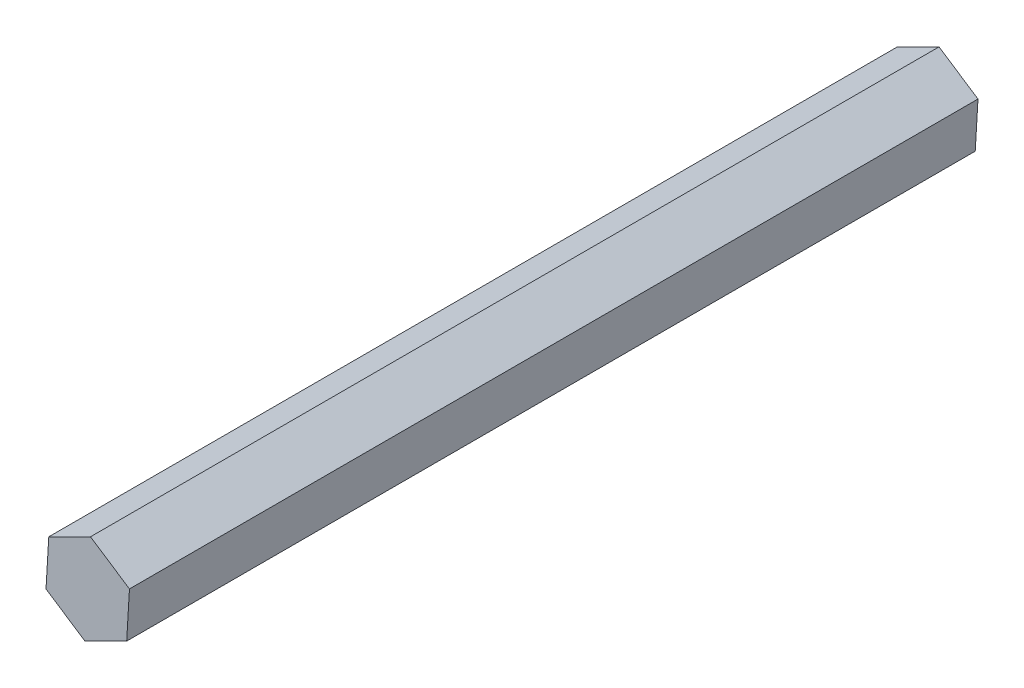
ISO-10303-21;
HEADER;
FILE_DESCRIPTION(('STEP AP214'),'2;1');
FILE_NAME('part.step','',(''),(''),'','','');
FILE_SCHEMA(('AUTOMOTIVE_DESIGN { 1 0 10303 214 1 1 1 1 }'));
ENDSEC;
DATA;
#1=APPLICATION_CONTEXT('core data for automotive mechanical design processes');
#2=APPLICATION_PROTOCOL_DEFINITION('international standard','automotive_design',2000,#1);
#3=PRODUCT_CONTEXT('',#1,'mechanical');
#4=PRODUCT('Part','Part','',(#3));
#5=PRODUCT_RELATED_PRODUCT_CATEGORY('part','',(#4));
#6=PRODUCT_DEFINITION_FORMATION('','',#4);
#7=PRODUCT_DEFINITION_CONTEXT('part definition',#1,'design');
#8=PRODUCT_DEFINITION('design','',#6,#7);
#9=PRODUCT_DEFINITION_SHAPE('','',#8);
#10=(LENGTH_UNIT() NAMED_UNIT(*) SI_UNIT(.MILLI.,.METRE.));
#11=(NAMED_UNIT(*) PLANE_ANGLE_UNIT() SI_UNIT($,.RADIAN.));
#12=(NAMED_UNIT(*) SI_UNIT($,.STERADIAN.) SOLID_ANGLE_UNIT());
#13=UNCERTAINTY_MEASURE_WITH_UNIT(LENGTH_MEASURE(1.E-05),#10,'distance_accuracy_value','');
#14=(GEOMETRIC_REPRESENTATION_CONTEXT(3) GLOBAL_UNCERTAINTY_ASSIGNED_CONTEXT((#13)) GLOBAL_UNIT_ASSIGNED_CONTEXT((#10,
#11,#12)) REPRESENTATION_CONTEXT('',''));
#15=CARTESIAN_POINT('',(0.,0.,0.));
#16=DIRECTION('',(0.,0.,1.));
#17=DIRECTION('',(1.,0.,0.));
#18=AXIS2_PLACEMENT_3D('',#15,#16,#17);
#19=CARTESIAN_POINT('',(4.59046471627994,-3.02811966219777,100.));
#20=DIRECTION('',(-0.998228412344605,0.059498208275286,0.));
#21=DIRECTION('',(-0.059498208275286,-0.998228412344605,0.));
#22=AXIS2_PLACEMENT_3D('',#19,#20,#21);
#23=PLANE('',#22);
#24=DIRECTION('',(0.059498208275286,0.998228412344605,0.));
#25=VECTOR('',#24,1.);
#26=CARTESIAN_POINT('',(4.59046471627994,-3.02811966219777,0.));
#27=LINE('',#26,#25);
#28=CARTESIAN_POINT('',(4.59046471627994,-3.02811966219777,0.));
#29=VERTEX_POINT('',#28);
#30=CARTESIAN_POINT('',(4.91766091130239,2.46139922837567,0.));
#31=VERTEX_POINT('',#30);
#32=EDGE_CURVE('E118',#29,#31,#27,.T.);
#33=ORIENTED_EDGE('',*,*,#32,.T.);
#34=DIRECTION('',(0.,0.,-1.));
#35=VECTOR('',#34,1.);
#36=CARTESIAN_POINT('',(4.91766091130239,2.46139922837567,100.));
#37=LINE('',#36,#35);
#38=CARTESIAN_POINT('',(4.91766091130239,2.46139922837567,100.));
#39=VERTEX_POINT('',#38);
#40=EDGE_CURVE('E11',#39,#31,#37,.T.);
#41=ORIENTED_EDGE('',*,*,#40,.F.);
#42=DIRECTION('',(0.059498208275286,0.998228412344605,0.));
#43=VECTOR('',#42,1.);
#44=CARTESIAN_POINT('',(4.59046471627994,-3.02811966219777,100.));
#45=LINE('',#44,#43);
#46=CARTESIAN_POINT('',(4.59046471627994,-3.02811966219777,100.));
#47=VERTEX_POINT('',#46);
#48=EDGE_CURVE('E128',#47,#39,#45,.T.);
#49=ORIENTED_EDGE('',*,*,#48,.F.);
#50=DIRECTION('',(0.,0.,-1.));
#51=VECTOR('',#50,1.);
#52=CARTESIAN_POINT('',(4.59046471627994,-3.02811966219777,100.));
#53=LINE('',#52,#51);
#54=EDGE_CURVE('E114',#47,#29,#53,.T.);
#55=ORIENTED_EDGE('',*,*,#54,.T.);
#56=EDGE_LOOP('',(#33,#41,#49,#55));
#57=FACE_BOUND('',#56,.T.);
#58=ADVANCED_FACE('F34',(#57),#23,.F.);
#59=CARTESIAN_POINT('',(4.91766091130239,2.46139922837567,100.));
#60=DIRECTION('',(-0.550641166018358,-0.834742059732193,0.));
#61=DIRECTION('',(0.834742059732193,-0.550641166018358,0.));
#62=AXIS2_PLACEMENT_3D('',#59,#60,#61);
#63=PLANE('',#62);
#64=DIRECTION('',(-0.834742059732193,0.550641166018358,0.));
#65=VECTOR('',#64,1.);
#66=CARTESIAN_POINT('',(4.91766091130239,2.46139922837567,0.));
#67=LINE('',#66,#65);
#68=CARTESIAN_POINT('',(0.32719619502245,5.48951889057344,0.));
#69=VERTEX_POINT('',#68);
#70=EDGE_CURVE('E121',#31,#69,#67,.T.);
#71=ORIENTED_EDGE('',*,*,#70,.T.);
#72=DIRECTION('',(0.,0.,-1.));
#73=VECTOR('',#72,1.);
#74=CARTESIAN_POINT('',(0.32719619502245,5.48951889057344,100.));
#75=LINE('',#74,#73);
#76=CARTESIAN_POINT('',(0.32719619502245,5.48951889057344,100.));
#77=VERTEX_POINT('',#76);
#78=EDGE_CURVE('E42',#77,#69,#75,.T.);
#79=ORIENTED_EDGE('',*,*,#78,.F.);
#80=DIRECTION('',(-0.834742059732193,0.550641166018358,0.));
#81=VECTOR('',#80,1.);
#82=CARTESIAN_POINT('',(4.91766091130239,2.46139922837567,100.));
#83=LINE('',#82,#81);
#84=EDGE_CURVE('E87',#39,#77,#83,.T.);
#85=ORIENTED_EDGE('',*,*,#84,.F.);
#86=ORIENTED_EDGE('',*,*,#40,.T.);
#87=EDGE_LOOP('',(#71,#79,#85,#86));
#88=FACE_BOUND('',#87,.T.);
#89=ADVANCED_FACE('F152',(#88),#63,.F.);
#90=CARTESIAN_POINT('',(0.32719619502245,5.48951889057344,100.));
#91=DIRECTION('',(0.447587246326247,-0.894240268007479,0.));
#92=DIRECTION('',(0.894240268007479,0.447587246326247,0.));
#93=AXIS2_PLACEMENT_3D('',#90,#91,#92);
#94=PLANE('',#93);
#95=DIRECTION('',(-0.894240268007479,-0.447587246326247,0.));
#96=VECTOR('',#95,1.);
#97=CARTESIAN_POINT('',(0.32719619502245,5.48951889057344,0.));
#98=LINE('',#97,#96);
#99=CARTESIAN_POINT('',(-4.59046471627994,3.02811966219777,0.));
#100=VERTEX_POINT('',#99);
#101=EDGE_CURVE('E123',#69,#100,#98,.T.);
#102=ORIENTED_EDGE('',*,*,#101,.T.);
#103=DIRECTION('',(0.,0.,-1.));
#104=VECTOR('',#103,1.);
#105=CARTESIAN_POINT('',(-4.59046471627994,3.02811966219777,100.));
#106=LINE('',#105,#104);
#107=CARTESIAN_POINT('',(-4.59046471627994,3.02811966219777,100.));
#108=VERTEX_POINT('',#107);
#109=EDGE_CURVE('E109',#108,#100,#106,.T.);
#110=ORIENTED_EDGE('',*,*,#109,.F.);
#111=DIRECTION('',(-0.894240268007479,-0.447587246326247,0.));
#112=VECTOR('',#111,1.);
#113=CARTESIAN_POINT('',(0.32719619502245,5.48951889057344,100.));
#114=LINE('',#113,#112);
#115=EDGE_CURVE('E100',#77,#108,#114,.T.);
#116=ORIENTED_EDGE('',*,*,#115,.F.);
#117=ORIENTED_EDGE('',*,*,#78,.T.);
#118=EDGE_LOOP('',(#102,#110,#116,#117));
#119=FACE_BOUND('',#118,.T.);
#120=ADVANCED_FACE('F134',(#119),#94,.F.);
#121=CARTESIAN_POINT('',(-4.59046471627994,3.02811966219777,100.));
#122=DIRECTION('',(0.998228412344605,-0.059498208275286,0.));
#123=DIRECTION('',(0.059498208275286,0.998228412344605,0.));
#124=AXIS2_PLACEMENT_3D('',#121,#122,#123);
#125=PLANE('',#124);
#126=DIRECTION('',(-0.059498208275286,-0.998228412344605,0.));
#127=VECTOR('',#126,1.);
#128=CARTESIAN_POINT('',(-4.59046471627994,3.02811966219777,0.));
#129=LINE('',#128,#127);
#130=CARTESIAN_POINT('',(-4.91766091130239,-2.46139922837567,0.));
#131=VERTEX_POINT('',#130);
#132=EDGE_CURVE('E108',#100,#131,#129,.T.);
#133=ORIENTED_EDGE('',*,*,#132,.T.);
#134=DIRECTION('',(0.,0.,-1.));
#135=VECTOR('',#134,1.);
#136=CARTESIAN_POINT('',(-4.91766091130239,-2.46139922837567,100.));
#137=LINE('',#136,#135);
#138=CARTESIAN_POINT('',(-4.91766091130239,-2.46139922837567,100.));
#139=VERTEX_POINT('',#138);
#140=EDGE_CURVE('E105',#139,#131,#137,.T.);
#141=ORIENTED_EDGE('',*,*,#140,.F.);
#142=DIRECTION('',(-0.059498208275286,-0.998228412344605,0.));
#143=VECTOR('',#142,1.);
#144=CARTESIAN_POINT('',(-4.59046471627994,3.02811966219777,100.));
#145=LINE('',#144,#143);
#146=EDGE_CURVE('E94',#108,#139,#145,.T.);
#147=ORIENTED_EDGE('',*,*,#146,.F.);
#148=ORIENTED_EDGE('',*,*,#109,.T.);
#149=EDGE_LOOP('',(#133,#141,#147,#148));
#150=FACE_BOUND('',#149,.T.);
#151=ADVANCED_FACE('F106',(#150),#125,.F.);
#152=CARTESIAN_POINT('',(-4.91766091130239,-2.46139922837567,100.));
#153=DIRECTION('',(0.550641166018358,0.834742059732193,0.));
#154=DIRECTION('',(-0.834742059732193,0.550641166018358,0.));
#155=AXIS2_PLACEMENT_3D('',#152,#153,#154);
#156=PLANE('',#155);
#157=DIRECTION('',(0.834742059732192,-0.550641166018358,0.));
#158=VECTOR('',#157,1.);
#159=CARTESIAN_POINT('',(-4.91766091130239,-2.46139922837567,0.));
#160=LINE('',#159,#158);
#161=CARTESIAN_POINT('',(-0.327196195022453,-5.48951889057344,0.));
#162=VERTEX_POINT('',#161);
#163=EDGE_CURVE('E73',#131,#162,#160,.T.);
#164=ORIENTED_EDGE('',*,*,#163,.T.);
#165=DIRECTION('',(0.,0.,-1.));
#166=VECTOR('',#165,1.);
#167=CARTESIAN_POINT('',(-0.327196195022453,-5.48951889057344,100.));
#168=LINE('',#167,#166);
#169=CARTESIAN_POINT('',(-0.327196195022453,-5.48951889057344,100.));
#170=VERTEX_POINT('',#169);
#171=EDGE_CURVE('E110',#170,#162,#168,.T.);
#172=ORIENTED_EDGE('',*,*,#171,.F.);
#173=DIRECTION('',(0.834742059732192,-0.550641166018358,0.));
#174=VECTOR('',#173,1.);
#175=CARTESIAN_POINT('',(-4.91766091130239,-2.46139922837567,100.));
#176=LINE('',#175,#174);
#177=EDGE_CURVE('E98',#139,#170,#176,.T.);
#178=ORIENTED_EDGE('',*,*,#177,.F.);
#179=ORIENTED_EDGE('',*,*,#140,.T.);
#180=EDGE_LOOP('',(#164,#172,#178,#179));
#181=FACE_BOUND('',#180,.T.);
#182=ADVANCED_FACE('F112',(#181),#156,.F.);
#183=CARTESIAN_POINT('',(-0.327196195022453,-5.48951889057344,100.));
#184=DIRECTION('',(-0.447587246326247,0.894240268007479,0.));
#185=DIRECTION('',(-0.894240268007479,-0.447587246326247,0.));
#186=AXIS2_PLACEMENT_3D('',#183,#184,#185);
#187=PLANE('',#186);
#188=DIRECTION('',(0.894240268007479,0.447587246326247,0.));
#189=VECTOR('',#188,1.);
#190=CARTESIAN_POINT('',(-0.327196195022453,-5.48951889057344,0.));
#191=LINE('',#190,#189);
#192=EDGE_CURVE('E79',#162,#29,#191,.T.);
#193=ORIENTED_EDGE('',*,*,#192,.T.);
#194=ORIENTED_EDGE('',*,*,#54,.F.);
#195=DIRECTION('',(0.894240268007479,0.447587246326247,0.));
#196=VECTOR('',#195,1.);
#197=CARTESIAN_POINT('',(-0.327196195022453,-5.48951889057344,100.));
#198=LINE('',#197,#196);
#199=EDGE_CURVE('E50',#170,#47,#198,.T.);
#200=ORIENTED_EDGE('',*,*,#199,.F.);
#201=ORIENTED_EDGE('',*,*,#171,.T.);
#202=EDGE_LOOP('',(#193,#194,#200,#201));
#203=FACE_BOUND('',#202,.T.);
#204=ADVANCED_FACE('F141',(#203),#187,.F.);
#205=CARTESIAN_POINT('',(0.,0.,100.));
#206=DIRECTION('',(0.,0.,1.));
#207=DIRECTION('',(1.,0.,0.));
#208=AXIS2_PLACEMENT_3D('',#205,#206,#207);
#209=PLANE('',#208);
#210=ORIENTED_EDGE('',*,*,#48,.T.);
#211=ORIENTED_EDGE('',*,*,#84,.T.);
#212=ORIENTED_EDGE('',*,*,#115,.T.);
#213=ORIENTED_EDGE('',*,*,#146,.T.);
#214=ORIENTED_EDGE('',*,*,#177,.T.);
#215=ORIENTED_EDGE('',*,*,#199,.T.);
#216=EDGE_LOOP('',(#210,#211,#212,#213,#214,#215));
#217=FACE_BOUND('',#216,.T.);
#218=ADVANCED_FACE('F96',(#217),#209,.T.);
#219=CARTESIAN_POINT('',(0.,0.,0.));
#220=DIRECTION('',(0.,0.,1.));
#221=DIRECTION('',(1.,0.,0.));
#222=AXIS2_PLACEMENT_3D('',#219,#220,#221);
#223=PLANE('',#222);
#224=ORIENTED_EDGE('',*,*,#32,.F.);
#225=ORIENTED_EDGE('',*,*,#192,.F.);
#226=ORIENTED_EDGE('',*,*,#163,.F.);
#227=ORIENTED_EDGE('',*,*,#132,.F.);
#228=ORIENTED_EDGE('',*,*,#101,.F.);
#229=ORIENTED_EDGE('',*,*,#70,.F.);
#230=EDGE_LOOP('',(#224,#225,#226,#227,#228,#229));
#231=FACE_BOUND('',#230,.T.);
#232=ADVANCED_FACE('F137',(#231),#223,.F.);
#233=CLOSED_SHELL('',(#58,#89,#120,#151,#182,#204,#218,#232));
#234=MANIFOLD_SOLID_BREP('B2',#233);
#235=ADVANCED_BREP_SHAPE_REPRESENTATION('',(#18,#234),#14);
#236=SHAPE_DEFINITION_REPRESENTATION(#9,#235);
ENDSEC;
END-ISO-10303-21;
